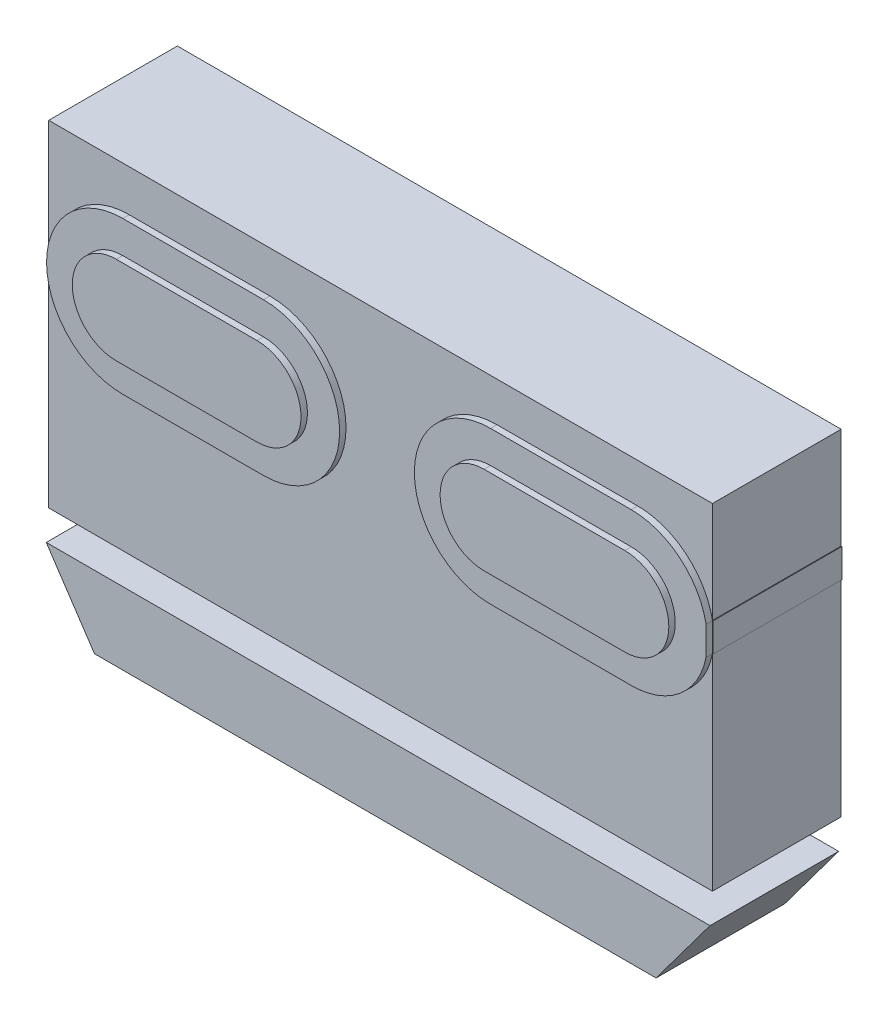
ISO-10303-21;
HEADER;
FILE_DESCRIPTION(('STEP AP214'),'2;1');
FILE_NAME('part.step','',(''),(''),'','','');
FILE_SCHEMA(('AUTOMOTIVE_DESIGN { 1 0 10303 214 1 1 1 1 }'));
ENDSEC;
DATA;
#1=APPLICATION_CONTEXT('core data for automotive mechanical design processes');
#2=APPLICATION_PROTOCOL_DEFINITION('international standard','automotive_design',2000,#1);
#3=PRODUCT_CONTEXT('',#1,'mechanical');
#4=PRODUCT('Part','Part','',(#3));
#5=PRODUCT_RELATED_PRODUCT_CATEGORY('part','',(#4));
#6=PRODUCT_DEFINITION_FORMATION('','',#4);
#7=PRODUCT_DEFINITION_CONTEXT('part definition',#1,'design');
#8=PRODUCT_DEFINITION('design','',#6,#7);
#9=PRODUCT_DEFINITION_SHAPE('','',#8);
#10=(LENGTH_UNIT() NAMED_UNIT(*) SI_UNIT(.MILLI.,.METRE.));
#11=(NAMED_UNIT(*) PLANE_ANGLE_UNIT() SI_UNIT($,.RADIAN.));
#12=(NAMED_UNIT(*) SI_UNIT($,.STERADIAN.) SOLID_ANGLE_UNIT());
#13=UNCERTAINTY_MEASURE_WITH_UNIT(LENGTH_MEASURE(1.E-05),#10,'distance_accuracy_value','');
#14=(GEOMETRIC_REPRESENTATION_CONTEXT(3) GLOBAL_UNCERTAINTY_ASSIGNED_CONTEXT((#13)) GLOBAL_UNIT_ASSIGNED_CONTEXT((#10,
#11,#12)) REPRESENTATION_CONTEXT('',''));
#15=CARTESIAN_POINT('',(0.,0.,0.));
#16=DIRECTION('',(0.,0.,1.));
#17=DIRECTION('',(1.,0.,0.));
#18=AXIS2_PLACEMENT_3D('',#15,#16,#17);
#19=CARTESIAN_POINT('',(0.,-29.4533206603702,20.));
#20=DIRECTION('',(0.,1.,0.));
#21=DIRECTION('',(0.,0.,1.));
#22=AXIS2_PLACEMENT_3D('',#19,#20,#21);
#23=PLANE('',#22);
#24=DIRECTION('',(1.,0.,0.));
#25=VECTOR('',#24,1.);
#26=CARTESIAN_POINT('',(0.,-29.4533206603702,0.));
#27=LINE('',#26,#25);
#28=CARTESIAN_POINT('',(-77.1454048954779,-29.4533206603702,0.));
#29=VERTEX_POINT('',#28);
#30=CARTESIAN_POINT('',(26.0461028836119,-29.4533206603702,0.));
#31=VERTEX_POINT('',#30);
#32=EDGE_CURVE('E107',#29,#31,#27,.T.);
#33=ORIENTED_EDGE('',*,*,#32,.F.);
#34=DIRECTION('',(0.,0.,-1.));
#35=VECTOR('',#34,1.);
#36=CARTESIAN_POINT('',(-77.1454048954779,-29.4533206603702,20.));
#37=LINE('',#36,#35);
#38=CARTESIAN_POINT('',(-77.1454048954779,-29.4533206603702,20.));
#39=VERTEX_POINT('',#38);
#40=EDGE_CURVE('E12',#39,#29,#37,.T.);
#41=ORIENTED_EDGE('',*,*,#40,.F.);
#42=DIRECTION('',(1.,0.,0.));
#43=VECTOR('',#42,1.);
#44=CARTESIAN_POINT('',(0.,-29.4533206603702,20.));
#45=LINE('',#44,#43);
#46=CARTESIAN_POINT('',(26.0461028836119,-29.4533206603702,20.));
#47=VERTEX_POINT('',#46);
#48=EDGE_CURVE('E92',#39,#47,#45,.T.);
#49=ORIENTED_EDGE('',*,*,#48,.T.);
#50=DIRECTION('',(0.,0.,-1.));
#51=VECTOR('',#50,1.);
#52=CARTESIAN_POINT('',(26.0461028836119,-29.4533206603702,20.));
#53=LINE('',#52,#51);
#54=EDGE_CURVE('E60',#47,#31,#53,.T.);
#55=ORIENTED_EDGE('',*,*,#54,.T.);
#56=EDGE_LOOP('',(#33,#41,#49,#55));
#57=FACE_BOUND('',#56,.T.);
#58=ADVANCED_FACE('F44',(#57),#23,.T.);
#59=CARTESIAN_POINT('',(-66.9800009224369,-44.6891917982016,20.));
#60=DIRECTION('',(0.83184470058085,0.555008463102641,0.));
#61=DIRECTION('',(-0.555008463102641,0.83184470058085,0.));
#62=AXIS2_PLACEMENT_3D('',#59,#60,#61);
#63=PLANE('',#62);
#64=DIRECTION('',(0.555008463102641,-0.83184470058085,0.));
#65=VECTOR('',#64,1.);
#66=CARTESIAN_POINT('',(-66.9800009224369,-44.6891917982016,0.));
#67=LINE('',#66,#65);
#68=CARTESIAN_POINT('',(-69.6456871757854,-40.6938707703688,0.));
#69=VERTEX_POINT('',#68);
#70=EDGE_CURVE('E98',#29,#69,#67,.T.);
#71=ORIENTED_EDGE('',*,*,#70,.T.);
#72=DIRECTION('',(0.,0.,-1.));
#73=VECTOR('',#72,1.);
#74=CARTESIAN_POINT('',(-69.6456871757854,-40.6938707703688,20.));
#75=LINE('',#74,#73);
#76=CARTESIAN_POINT('',(-69.6456871757854,-40.6938707703688,20.));
#77=VERTEX_POINT('',#76);
#78=EDGE_CURVE('E52',#77,#69,#75,.T.);
#79=ORIENTED_EDGE('',*,*,#78,.F.);
#80=DIRECTION('',(0.555008463102641,-0.83184470058085,0.));
#81=VECTOR('',#80,1.);
#82=CARTESIAN_POINT('',(-66.9800009224369,-44.6891917982016,20.));
#83=LINE('',#82,#81);
#84=EDGE_CURVE('E86',#39,#77,#83,.T.);
#85=ORIENTED_EDGE('',*,*,#84,.F.);
#86=ORIENTED_EDGE('',*,*,#40,.T.);
#87=EDGE_LOOP('',(#71,#79,#85,#86));
#88=FACE_BOUND('',#87,.T.);
#89=ADVANCED_FACE('F96',(#88),#63,.F.);
#90=CARTESIAN_POINT('',(0.,-40.6938707703688,20.));
#91=DIRECTION('',(0.,1.,0.));
#92=DIRECTION('',(0.,0.,1.));
#93=AXIS2_PLACEMENT_3D('',#90,#91,#92);
#94=PLANE('',#93);
#95=DIRECTION('',(1.,0.,0.));
#96=VECTOR('',#95,1.);
#97=CARTESIAN_POINT('',(0.,-40.6938707703688,0.));
#98=LINE('',#97,#96);
#99=CARTESIAN_POINT('',(17.6642786454124,-40.6938707703688,0.));
#100=VERTEX_POINT('',#99);
#101=EDGE_CURVE('E110',#69,#100,#98,.T.);
#102=ORIENTED_EDGE('',*,*,#101,.T.);
#103=DIRECTION('',(0.,0.,-1.));
#104=VECTOR('',#103,1.);
#105=CARTESIAN_POINT('',(17.6642786454124,-40.6938707703688,20.));
#106=LINE('',#105,#104);
#107=CARTESIAN_POINT('',(17.6642786454124,-40.6938707703688,20.));
#108=VERTEX_POINT('',#107);
#109=EDGE_CURVE('E74',#108,#100,#106,.T.);
#110=ORIENTED_EDGE('',*,*,#109,.F.);
#111=DIRECTION('',(1.,0.,0.));
#112=VECTOR('',#111,1.);
#113=CARTESIAN_POINT('',(0.,-40.6938707703688,20.));
#114=LINE('',#113,#112);
#115=EDGE_CURVE('E91',#77,#108,#114,.T.);
#116=ORIENTED_EDGE('',*,*,#115,.F.);
#117=ORIENTED_EDGE('',*,*,#78,.T.);
#118=EDGE_LOOP('',(#102,#110,#116,#117));
#119=FACE_BOUND('',#118,.T.);
#120=ADVANCED_FACE('F101',(#119),#94,.F.);
#121=CARTESIAN_POINT('',(30.8532809400683,-23.0065944709778,20.));
#122=DIRECTION('',(0.801660247141003,-0.59777993287984,0.));
#123=DIRECTION('',(0.59777993287984,0.801660247141003,0.));
#124=AXIS2_PLACEMENT_3D('',#121,#122,#123);
#125=PLANE('',#124);
#126=DIRECTION('',(-0.59777993287984,-0.801660247141003,0.));
#127=VECTOR('',#126,1.);
#128=CARTESIAN_POINT('',(30.8532809400683,-23.0065944709778,0.));
#129=LINE('',#128,#127);
#130=EDGE_CURVE('E112',#31,#100,#129,.T.);
#131=ORIENTED_EDGE('',*,*,#130,.F.);
#132=ORIENTED_EDGE('',*,*,#54,.F.);
#133=DIRECTION('',(-0.59777993287984,-0.801660247141003,0.));
#134=VECTOR('',#133,1.);
#135=CARTESIAN_POINT('',(30.8532809400683,-23.0065944709778,20.));
#136=LINE('',#135,#134);
#137=EDGE_CURVE('E102',#47,#108,#136,.T.);
#138=ORIENTED_EDGE('',*,*,#137,.T.);
#139=ORIENTED_EDGE('',*,*,#109,.T.);
#140=EDGE_LOOP('',(#131,#132,#138,#139));
#141=FACE_BOUND('',#140,.T.);
#142=ADVANCED_FACE('F117',(#141),#125,.T.);
#143=CARTESIAN_POINT('',(0.,0.,20.));
#144=DIRECTION('',(0.,0.,1.));
#145=DIRECTION('',(1.,0.,0.));
#146=AXIS2_PLACEMENT_3D('',#143,#144,#145);
#147=PLANE('',#146);
#148=ORIENTED_EDGE('',*,*,#48,.F.);
#149=ORIENTED_EDGE('',*,*,#84,.T.);
#150=ORIENTED_EDGE('',*,*,#115,.T.);
#151=ORIENTED_EDGE('',*,*,#137,.F.);
#152=EDGE_LOOP('',(#148,#149,#150,#151));
#153=FACE_BOUND('',#152,.T.);
#154=ADVANCED_FACE('F88',(#153),#147,.T.);
#155=CARTESIAN_POINT('',(0.,0.,0.));
#156=DIRECTION('',(0.,0.,1.));
#157=DIRECTION('',(1.,0.,0.));
#158=AXIS2_PLACEMENT_3D('',#155,#156,#157);
#159=PLANE('',#158);
#160=ORIENTED_EDGE('',*,*,#32,.T.);
#161=ORIENTED_EDGE('',*,*,#130,.T.);
#162=ORIENTED_EDGE('',*,*,#101,.F.);
#163=ORIENTED_EDGE('',*,*,#70,.F.);
#164=EDGE_LOOP('',(#160,#161,#162,#163));
#165=FACE_BOUND('',#164,.T.);
#166=ADVANCED_FACE('F124',(#165),#159,.F.);
#167=CLOSED_SHELL('',(#58,#89,#120,#142,#154,#166));
#168=MANIFOLD_SOLID_BREP('B2',#167);
#169=CARTESIAN_POINT('',(0.,0.,21.));
#170=DIRECTION('',(0.,0.,1.));
#171=DIRECTION('',(1.,0.,0.));
#172=AXIS2_PLACEMENT_3D('',#169,#170,#171);
#173=PLANE('',#172);
#174=DIRECTION('',(1.,0.,0.));
#175=VECTOR('',#174,1.);
#176=CARTESIAN_POINT('',(0.,21.4315094426788,21.));
#177=LINE('',#176,#175);
#178=CARTESIAN_POINT('',(-7.076489515905,21.4315094426788,21.));
#179=VERTEX_POINT('',#178);
#180=CARTESIAN_POINT('',(14.8067531555051,21.4315094426788,21.));
#181=VERTEX_POINT('',#180);
#182=EDGE_CURVE('E416',#179,#181,#177,.T.);
#183=ORIENTED_EDGE('',*,*,#182,.F.);
#184=CARTESIAN_POINT('',(-7.076489515905,9.59445588053529,21.));
#185=DIRECTION('',(0.,0.,1.));
#186=DIRECTION('',(1.,0.,0.));
#187=AXIS2_PLACEMENT_3D('',#184,#185,#186);
#188=CIRCLE('',#187,11.8370535621435);
#189=CARTESIAN_POINT('',(-7.076489515905,-2.24259768160822,21.));
#190=VERTEX_POINT('',#189);
#191=EDGE_CURVE('E419',#179,#190,#188,.T.);
#192=ORIENTED_EDGE('',*,*,#191,.T.);
#193=DIRECTION('',(1.,0.,0.));
#194=VECTOR('',#193,1.);
#195=CARTESIAN_POINT('',(0.,-2.24259768160822,21.));
#196=LINE('',#195,#194);
#197=CARTESIAN_POINT('',(14.8067531555051,-2.24259768160822,21.));
#198=VERTEX_POINT('',#197);
#199=EDGE_CURVE('E421',#190,#198,#196,.T.);
#200=ORIENTED_EDGE('',*,*,#199,.T.);
#201=CARTESIAN_POINT('',(14.8067531555051,9.59445588053529,21.));
#202=DIRECTION('',(0.,0.,1.));
#203=DIRECTION('',(1.,0.,0.));
#204=AXIS2_PLACEMENT_3D('',#201,#202,#203);
#205=CIRCLE('',#204,11.8370535621435);
#206=CARTESIAN_POINT('',(26.4300900283418,7.35528706742426,21.));
#207=VERTEX_POINT('',#206);
#208=EDGE_CURVE('E423',#198,#207,#205,.T.);
#209=ORIENTED_EDGE('',*,*,#208,.T.);
#210=DIRECTION('',(0.,-1.,0.));
#211=VECTOR('',#210,1.);
#212=CARTESIAN_POINT('',(26.4300900283418,0.,21.));
#213=LINE('',#212,#211);
#214=CARTESIAN_POINT('',(26.4300900283418,11.8336246936463,21.));
#215=VERTEX_POINT('',#214);
#216=EDGE_CURVE('E425',#215,#207,#213,.T.);
#217=ORIENTED_EDGE('',*,*,#216,.F.);
#218=EDGE_CURVE('E426',#215,#181,#205,.T.);
#219=ORIENTED_EDGE('',*,*,#218,.T.);
#220=EDGE_LOOP('',(#183,#192,#200,#209,#217,#219));
#221=FACE_BOUND('',#220,.T.);
#222=DIRECTION('',(-1.,0.,0.));
#223=VECTOR('',#222,1.);
#224=CARTESIAN_POINT('',(0.,2.75740231839178,21.));
#225=LINE('',#224,#223);
#226=CARTESIAN_POINT('',(14.8067531555051,2.75740231839178,21.));
#227=VERTEX_POINT('',#226);
#228=CARTESIAN_POINT('',(-7.076489515905,2.75740231839178,21.));
#229=VERTEX_POINT('',#228);
#230=EDGE_CURVE('E180',#227,#229,#225,.T.);
#231=ORIENTED_EDGE('',*,*,#230,.T.);
#232=CARTESIAN_POINT('',(-7.076489515905,9.59445588053529,21.));
#233=DIRECTION('',(0.,0.,1.));
#234=DIRECTION('',(1.,0.,0.));
#235=AXIS2_PLACEMENT_3D('',#232,#233,#234);
#236=CIRCLE('',#235,6.83705356214351);
#237=CARTESIAN_POINT('',(-7.076489515905,16.4315094426788,21.));
#238=VERTEX_POINT('',#237);
#239=EDGE_CURVE('E42',#229,#238,#236,.F.);
#240=ORIENTED_EDGE('',*,*,#239,.T.);
#241=DIRECTION('',(-1.,0.,0.));
#242=VECTOR('',#241,1.);
#243=CARTESIAN_POINT('',(0.,16.4315094426788,21.));
#244=LINE('',#243,#242);
#245=CARTESIAN_POINT('',(14.8067531555051,16.4315094426788,21.));
#246=VERTEX_POINT('',#245);
#247=EDGE_CURVE('E342',#246,#238,#244,.T.);
#248=ORIENTED_EDGE('',*,*,#247,.F.);
#249=CARTESIAN_POINT('',(14.8067531555051,9.59445588053529,21.));
#250=DIRECTION('',(0.,0.,1.));
#251=DIRECTION('',(1.,0.,0.));
#252=AXIS2_PLACEMENT_3D('',#249,#250,#251);
#253=CIRCLE('',#252,6.83705356214351);
#254=EDGE_CURVE('E190',#246,#227,#253,.F.);
#255=ORIENTED_EDGE('',*,*,#254,.T.);
#256=EDGE_LOOP('',(#231,#240,#248,#255));
#257=FACE_BOUND('',#256,.T.);
#258=ADVANCED_FACE('F172',(#221,#257),#173,.T.);
#259=CARTESIAN_POINT('',(0.,0.,21.));
#260=DIRECTION('',(0.,0.,1.));
#261=DIRECTION('',(1.,0.,0.));
#262=AXIS2_PLACEMENT_3D('',#259,#260,#261);
#263=PLANE('',#262);
#264=DIRECTION('',(1.,0.,0.));
#265=VECTOR('',#264,1.);
#266=CARTESIAN_POINT('',(0.,21.1126843900306,21.));
#267=LINE('',#266,#265);
#268=CARTESIAN_POINT('',(-64.2583537784373,21.1126843900306,21.));
#269=VERTEX_POINT('',#268);
#270=CARTESIAN_POINT('',(-42.3751111070271,21.1126843900306,21.));
#271=VERTEX_POINT('',#270);
#272=EDGE_CURVE('E447',#269,#271,#267,.T.);
#273=ORIENTED_EDGE('',*,*,#272,.F.);
#274=CARTESIAN_POINT('',(-64.2583537784373,9.27563082788707,21.));
#275=DIRECTION('',(0.,0.,1.));
#276=DIRECTION('',(1.,0.,0.));
#277=AXIS2_PLACEMENT_3D('',#274,#275,#276);
#278=CIRCLE('',#277,11.8370535621435);
#279=CARTESIAN_POINT('',(-64.2583537784373,-2.56142273425644,21.));
#280=VERTEX_POINT('',#279);
#281=EDGE_CURVE('E450',#269,#280,#278,.T.);
#282=ORIENTED_EDGE('',*,*,#281,.T.);
#283=DIRECTION('',(1.,0.,0.));
#284=VECTOR('',#283,1.);
#285=CARTESIAN_POINT('',(0.,-2.56142273425644,21.));
#286=LINE('',#285,#284);
#287=CARTESIAN_POINT('',(-42.3751111070271,-2.56142273425644,21.));
#288=VERTEX_POINT('',#287);
#289=EDGE_CURVE('E452',#280,#288,#286,.T.);
#290=ORIENTED_EDGE('',*,*,#289,.T.);
#291=CARTESIAN_POINT('',(-42.3751111070271,9.27563082788707,21.));
#292=DIRECTION('',(0.,0.,1.));
#293=DIRECTION('',(1.,0.,0.));
#294=AXIS2_PLACEMENT_3D('',#291,#292,#293);
#295=CIRCLE('',#294,11.8370535621435);
#296=EDGE_CURVE('E454',#288,#271,#295,.T.);
#297=ORIENTED_EDGE('',*,*,#296,.T.);
#298=EDGE_LOOP('',(#273,#282,#290,#297));
#299=FACE_BOUND('',#298,.T.);
#300=DIRECTION('',(-1.,0.,0.));
#301=VECTOR('',#300,1.);
#302=CARTESIAN_POINT('',(0.,2.43857726574356,21.));
#303=LINE('',#302,#301);
#304=CARTESIAN_POINT('',(-42.3751111070271,2.43857726574356,21.));
#305=VERTEX_POINT('',#304);
#306=CARTESIAN_POINT('',(-64.2583537784373,2.43857726574356,21.));
#307=VERTEX_POINT('',#306);
#308=EDGE_CURVE('E528',#305,#307,#303,.T.);
#309=ORIENTED_EDGE('',*,*,#308,.T.);
#310=CARTESIAN_POINT('',(-64.2583537784373,9.27563082788707,21.));
#311=DIRECTION('',(0.,0.,1.));
#312=DIRECTION('',(1.,0.,0.));
#313=AXIS2_PLACEMENT_3D('',#310,#311,#312);
#314=CIRCLE('',#313,6.83705356214351);
#315=CARTESIAN_POINT('',(-64.2583537784373,16.1126843900306,21.));
#316=VERTEX_POINT('',#315);
#317=EDGE_CURVE('E530',#307,#316,#314,.F.);
#318=ORIENTED_EDGE('',*,*,#317,.T.);
#319=DIRECTION('',(-1.,0.,0.));
#320=VECTOR('',#319,1.);
#321=CARTESIAN_POINT('',(0.,16.1126843900306,21.));
#322=LINE('',#321,#320);
#323=CARTESIAN_POINT('',(-42.3751111070271,16.1126843900306,21.));
#324=VERTEX_POINT('',#323);
#325=EDGE_CURVE('E523',#324,#316,#322,.T.);
#326=ORIENTED_EDGE('',*,*,#325,.F.);
#327=CARTESIAN_POINT('',(-42.3751111070271,9.27563082788707,21.));
#328=DIRECTION('',(0.,0.,1.));
#329=DIRECTION('',(1.,0.,0.));
#330=AXIS2_PLACEMENT_3D('',#327,#328,#329);
#331=CIRCLE('',#330,6.83705356214351);
#332=EDGE_CURVE('E526',#324,#305,#331,.F.);
#333=ORIENTED_EDGE('',*,*,#332,.T.);
#334=EDGE_LOOP('',(#309,#318,#326,#333));
#335=FACE_BOUND('',#334,.T.);
#336=ADVANCED_FACE('F535',(#299,#335),#263,.T.);
#337=CARTESIAN_POINT('',(26.4300900283418,0.,20.));
#338=DIRECTION('',(1.,0.,0.));
#339=DIRECTION('',(0.,0.,-1.));
#340=AXIS2_PLACEMENT_3D('',#337,#338,#339);
#341=PLANE('',#340);
#342=DIRECTION('',(0.,0.,1.));
#343=VECTOR('',#342,1.);
#344=CARTESIAN_POINT('',(26.4300900283418,11.8336246936463,20.));
#345=LINE('',#344,#343);
#346=CARTESIAN_POINT('',(26.4300900283418,11.8336246936463,0.));
#347=VERTEX_POINT('',#346);
#348=CARTESIAN_POINT('',(26.4300900283418,11.8336246936463,20.));
#349=VERTEX_POINT('',#348);
#350=EDGE_CURVE('E391',#347,#349,#345,.T.);
#351=ORIENTED_EDGE('',*,*,#350,.F.);
#352=DIRECTION('',(0.,-1.,0.));
#353=VECTOR('',#352,1.);
#354=CARTESIAN_POINT('',(26.4300900283418,0.,0.));
#355=LINE('',#354,#353);
#356=CARTESIAN_POINT('',(26.4300900283418,27.5743521353241,0.));
#357=VERTEX_POINT('',#356);
#358=EDGE_CURVE('E472',#357,#347,#355,.T.);
#359=ORIENTED_EDGE('',*,*,#358,.F.);
#360=DIRECTION('',(0.,0.,-1.));
#361=VECTOR('',#360,1.);
#362=CARTESIAN_POINT('',(26.4300900283418,27.5743521353241,20.));
#363=LINE('',#362,#361);
#364=CARTESIAN_POINT('',(26.4300900283418,27.5743521353241,20.));
#365=VERTEX_POINT('',#364);
#366=EDGE_CURVE('E520',#365,#357,#363,.T.);
#367=ORIENTED_EDGE('',*,*,#366,.F.);
#368=DIRECTION('',(0.,-1.,0.));
#369=VECTOR('',#368,1.);
#370=CARTESIAN_POINT('',(26.4300900283418,0.,20.));
#371=LINE('',#370,#369);
#372=EDGE_CURVE('E477',#365,#349,#371,.T.);
#373=ORIENTED_EDGE('',*,*,#372,.T.);
#374=EDGE_LOOP('',(#351,#359,#367,#373));
#375=FACE_BOUND('',#374,.T.);
#376=ADVANCED_FACE('F569',(#375),#341,.T.);
#377=DIRECTION('',(0.,-1.,0.));
#378=VECTOR('',#377,1.);
#379=CARTESIAN_POINT('',(26.4300900283418,11.8336246936463,20.));
#380=LINE('',#379,#378);
#381=CARTESIAN_POINT('',(26.4300900283418,7.35528706742426,20.));
#382=VERTEX_POINT('',#381);
#383=EDGE_CURVE('E386',#349,#382,#380,.T.);
#384=ORIENTED_EDGE('',*,*,#383,.F.);
#385=DIRECTION('',(0.,0.,-1.));
#386=VECTOR('',#385,1.);
#387=CARTESIAN_POINT('',(26.4300900283418,11.8336246936463,21.));
#388=LINE('',#387,#386);
#389=EDGE_CURVE('E432',#215,#349,#388,.T.);
#390=ORIENTED_EDGE('',*,*,#389,.F.);
#391=ORIENTED_EDGE('',*,*,#216,.T.);
#392=DIRECTION('',(0.,0.,-1.));
#393=VECTOR('',#392,1.);
#394=CARTESIAN_POINT('',(26.4300900283418,7.35528706742426,21.));
#395=LINE('',#394,#393);
#396=EDGE_CURVE('E435',#207,#382,#395,.T.);
#397=ORIENTED_EDGE('',*,*,#396,.T.);
#398=EDGE_LOOP('',(#384,#390,#391,#397));
#399=FACE_BOUND('',#398,.T.);
#400=ADVANCED_FACE('F623',(#399),#341,.T.);
#401=CARTESIAN_POINT('',(0.,27.5743521353241,20.));
#402=DIRECTION('',(0.,1.,0.));
#403=DIRECTION('',(0.,0.,1.));
#404=AXIS2_PLACEMENT_3D('',#401,#402,#403);
#405=PLANE('',#404);
#406=DIRECTION('',(1.,0.,0.));
#407=VECTOR('',#406,1.);
#408=CARTESIAN_POINT('',(0.,27.5743521353241,0.));
#409=LINE('',#408,#407);
#410=CARTESIAN_POINT('',(-76.7614177507479,27.5743521353241,0.));
#411=VERTEX_POINT('',#410);
#412=EDGE_CURVE('E468',#411,#357,#409,.T.);
#413=ORIENTED_EDGE('',*,*,#412,.F.);
#414=DIRECTION('',(0.,0.,-1.));
#415=VECTOR('',#414,1.);
#416=CARTESIAN_POINT('',(-76.7614177507479,27.5743521353241,20.));
#417=LINE('',#416,#415);
#418=CARTESIAN_POINT('',(-76.7614177507479,27.5743521353241,20.));
#419=VERTEX_POINT('',#418);
#420=EDGE_CURVE('E518',#419,#411,#417,.T.);
#421=ORIENTED_EDGE('',*,*,#420,.F.);
#422=DIRECTION('',(1.,0.,0.));
#423=VECTOR('',#422,1.);
#424=CARTESIAN_POINT('',(0.,27.5743521353241,20.));
#425=LINE('',#424,#423);
#426=EDGE_CURVE('E481',#419,#365,#425,.T.);
#427=ORIENTED_EDGE('',*,*,#426,.T.);
#428=ORIENTED_EDGE('',*,*,#366,.T.);
#429=EDGE_LOOP('',(#413,#421,#427,#428));
#430=FACE_BOUND('',#429,.T.);
#431=ADVANCED_FACE('F174',(#430),#405,.T.);
#432=CARTESIAN_POINT('',(-76.7614177507479,0.,20.));
#433=DIRECTION('',(1.,0.,0.));
#434=DIRECTION('',(0.,0.,-1.));
#435=AXIS2_PLACEMENT_3D('',#432,#433,#434);
#436=PLANE('',#435);
#437=DIRECTION('',(0.,-1.,0.));
#438=VECTOR('',#437,1.);
#439=CARTESIAN_POINT('',(-76.7614177507479,0.,0.));
#440=LINE('',#439,#438);
#441=CARTESIAN_POINT('',(-76.7614177507479,-24.6202433678059,0.));
#442=VERTEX_POINT('',#441);
#443=EDGE_CURVE('E508',#411,#442,#440,.T.);
#444=ORIENTED_EDGE('',*,*,#443,.T.);
#445=DIRECTION('',(0.,0.,-1.));
#446=VECTOR('',#445,1.);
#447=CARTESIAN_POINT('',(-76.7614177507479,-24.6202433678059,20.));
#448=LINE('',#447,#446);
#449=CARTESIAN_POINT('',(-76.7614177507479,-24.6202433678059,20.));
#450=VERTEX_POINT('',#449);
#451=EDGE_CURVE('E515',#450,#442,#448,.T.);
#452=ORIENTED_EDGE('',*,*,#451,.F.);
#453=DIRECTION('',(0.,-1.,0.));
#454=VECTOR('',#453,1.);
#455=CARTESIAN_POINT('',(-76.7614177507479,0.,20.));
#456=LINE('',#455,#454);
#457=EDGE_CURVE('E485',#419,#450,#456,.T.);
#458=ORIENTED_EDGE('',*,*,#457,.F.);
#459=ORIENTED_EDGE('',*,*,#420,.T.);
#460=EDGE_LOOP('',(#444,#452,#458,#459));
#461=FACE_BOUND('',#460,.T.);
#462=ADVANCED_FACE('F625',(#461),#436,.F.);
#463=CARTESIAN_POINT('',(0.,-24.6202433678059,20.));
#464=DIRECTION('',(0.,1.,0.));
#465=DIRECTION('',(0.,0.,1.));
#466=AXIS2_PLACEMENT_3D('',#463,#464,#465);
#467=PLANE('',#466);
#468=DIRECTION('',(1.,0.,0.));
#469=VECTOR('',#468,1.);
#470=CARTESIAN_POINT('',(0.,-24.6202433678059,0.));
#471=LINE('',#470,#469);
#472=CARTESIAN_POINT('',(26.4300900283418,-24.6202433678059,0.));
#473=VERTEX_POINT('',#472);
#474=EDGE_CURVE('E510',#442,#473,#471,.T.);
#475=ORIENTED_EDGE('',*,*,#474,.T.);
#476=DIRECTION('',(0.,0.,-1.));
#477=VECTOR('',#476,1.);
#478=CARTESIAN_POINT('',(26.4300900283418,-24.6202433678059,20.));
#479=LINE('',#478,#477);
#480=CARTESIAN_POINT('',(26.4300900283418,-24.6202433678059,20.));
#481=VERTEX_POINT('',#480);
#482=EDGE_CURVE('E502',#481,#473,#479,.T.);
#483=ORIENTED_EDGE('',*,*,#482,.F.);
#484=DIRECTION('',(1.,0.,0.));
#485=VECTOR('',#484,1.);
#486=CARTESIAN_POINT('',(0.,-24.6202433678059,20.));
#487=LINE('',#486,#485);
#488=EDGE_CURVE('E487',#450,#481,#487,.T.);
#489=ORIENTED_EDGE('',*,*,#488,.F.);
#490=ORIENTED_EDGE('',*,*,#451,.T.);
#491=EDGE_LOOP('',(#475,#483,#489,#490));
#492=FACE_BOUND('',#491,.T.);
#493=ADVANCED_FACE('F621',(#492),#467,.F.);
#494=DIRECTION('',(0.,0.,-1.));
#495=VECTOR('',#494,1.);
#496=CARTESIAN_POINT('',(26.4300900283418,7.35528706742426,20.));
#497=LINE('',#496,#495);
#498=CARTESIAN_POINT('',(26.4300900283418,7.35528706742426,0.));
#499=VERTEX_POINT('',#498);
#500=EDGE_CURVE('E400',#382,#499,#497,.T.);
#501=ORIENTED_EDGE('',*,*,#500,.F.);
#502=EDGE_CURVE('E482',#382,#481,#371,.T.);
#503=ORIENTED_EDGE('',*,*,#502,.T.);
#504=ORIENTED_EDGE('',*,*,#482,.T.);
#505=EDGE_CURVE('E505',#499,#473,#355,.T.);
#506=ORIENTED_EDGE('',*,*,#505,.F.);
#507=EDGE_LOOP('',(#501,#503,#504,#506));
#508=FACE_BOUND('',#507,.T.);
#509=ADVANCED_FACE('F614',(#508),#341,.T.);
#510=CARTESIAN_POINT('',(0.,0.,20.));
#511=DIRECTION('',(0.,0.,1.));
#512=DIRECTION('',(1.,0.,0.));
#513=AXIS2_PLACEMENT_3D('',#510,#511,#512);
#514=PLANE('',#513);
#515=CARTESIAN_POINT('',(-7.076489515905,9.59445588053529,20.));
#516=DIRECTION('',(0.,0.,1.));
#517=DIRECTION('',(1.,0.,0.));
#518=AXIS2_PLACEMENT_3D('',#515,#516,#517);
#519=CIRCLE('',#518,11.8370535621435);
#520=CARTESIAN_POINT('',(-7.076489515905,21.4315094426788,20.));
#521=VERTEX_POINT('',#520);
#522=CARTESIAN_POINT('',(-7.076489515905,-2.24259768160822,20.));
#523=VERTEX_POINT('',#522);
#524=EDGE_CURVE('E469',#521,#523,#519,.T.);
#525=ORIENTED_EDGE('',*,*,#524,.F.);
#526=DIRECTION('',(1.,0.,0.));
#527=VECTOR('',#526,1.);
#528=CARTESIAN_POINT('',(0.,21.4315094426788,20.));
#529=LINE('',#528,#527);
#530=CARTESIAN_POINT('',(14.8067531555051,21.4315094426788,20.));
#531=VERTEX_POINT('',#530);
#532=EDGE_CURVE('E471',#521,#531,#529,.T.);
#533=ORIENTED_EDGE('',*,*,#532,.T.);
#534=CARTESIAN_POINT('',(14.8067531555051,9.59445588053529,20.));
#535=DIRECTION('',(0.,0.,1.));
#536=DIRECTION('',(1.,0.,0.));
#537=AXIS2_PLACEMENT_3D('',#534,#535,#536);
#538=CIRCLE('',#537,11.8370535621435);
#539=EDGE_CURVE('E475',#349,#531,#538,.T.);
#540=ORIENTED_EDGE('',*,*,#539,.F.);
#541=ORIENTED_EDGE('',*,*,#372,.F.);
#542=ORIENTED_EDGE('',*,*,#426,.F.);
#543=ORIENTED_EDGE('',*,*,#457,.T.);
#544=ORIENTED_EDGE('',*,*,#488,.T.);
#545=ORIENTED_EDGE('',*,*,#502,.F.);
#546=CARTESIAN_POINT('',(14.8067531555051,-2.24259768160822,20.));
#547=VERTEX_POINT('',#546);
#548=EDGE_CURVE('E478',#547,#382,#538,.T.);
#549=ORIENTED_EDGE('',*,*,#548,.F.);
#550=DIRECTION('',(1.,0.,0.));
#551=VECTOR('',#550,1.);
#552=CARTESIAN_POINT('',(0.,-2.24259768160822,20.));
#553=LINE('',#552,#551);
#554=EDGE_CURVE('E489',#523,#547,#553,.T.);
#555=ORIENTED_EDGE('',*,*,#554,.F.);
#556=EDGE_LOOP('',(#525,#533,#540,#541,#542,#543,#544,#545,#549,#555));
#557=FACE_BOUND('',#556,.T.);
#558=CARTESIAN_POINT('',(-64.2583537784373,9.27563082788707,20.));
#559=DIRECTION('',(0.,0.,1.));
#560=DIRECTION('',(1.,0.,0.));
#561=AXIS2_PLACEMENT_3D('',#558,#559,#560);
#562=CIRCLE('',#561,11.8370535621435);
#563=CARTESIAN_POINT('',(-64.2583537784373,21.1126843900306,20.));
#564=VERTEX_POINT('',#563);
#565=CARTESIAN_POINT('',(-64.2583537784373,-2.56142273425644,20.));
#566=VERTEX_POINT('',#565);
#567=EDGE_CURVE('E491',#564,#566,#562,.T.);
#568=ORIENTED_EDGE('',*,*,#567,.F.);
#569=DIRECTION('',(1.,0.,0.));
#570=VECTOR('',#569,1.);
#571=CARTESIAN_POINT('',(0.,21.1126843900306,20.));
#572=LINE('',#571,#570);
#573=CARTESIAN_POINT('',(-42.3751111070271,21.1126843900306,20.));
#574=VERTEX_POINT('',#573);
#575=EDGE_CURVE('E494',#564,#574,#572,.T.);
#576=ORIENTED_EDGE('',*,*,#575,.T.);
#577=CARTESIAN_POINT('',(-42.3751111070271,9.27563082788707,20.));
#578=DIRECTION('',(0.,0.,1.));
#579=DIRECTION('',(1.,0.,0.));
#580=AXIS2_PLACEMENT_3D('',#577,#578,#579);
#581=CIRCLE('',#580,11.8370535621435);
#582=CARTESIAN_POINT('',(-42.3751111070271,-2.56142273425644,20.));
#583=VERTEX_POINT('',#582);
#584=EDGE_CURVE('E496',#583,#574,#581,.T.);
#585=ORIENTED_EDGE('',*,*,#584,.F.);
#586=DIRECTION('',(1.,0.,0.));
#587=VECTOR('',#586,1.);
#588=CARTESIAN_POINT('',(0.,-2.56142273425644,20.));
#589=LINE('',#588,#587);
#590=EDGE_CURVE('E499',#566,#583,#589,.T.);
#591=ORIENTED_EDGE('',*,*,#590,.F.);
#592=EDGE_LOOP('',(#568,#576,#585,#591));
#593=FACE_BOUND('',#592,.T.);
#594=ADVANCED_FACE('F611',(#557,#593),#514,.T.);
#595=CARTESIAN_POINT('',(0.,0.,0.));
#596=DIRECTION('',(0.,0.,1.));
#597=DIRECTION('',(1.,0.,0.));
#598=AXIS2_PLACEMENT_3D('',#595,#596,#597);
#599=PLANE('',#598);
#600=ORIENTED_EDGE('',*,*,#412,.T.);
#601=ORIENTED_EDGE('',*,*,#358,.T.);
#602=DIRECTION('',(-1.,0.,0.));
#603=VECTOR('',#602,1.);
#604=CARTESIAN_POINT('',(26.5300900283418,11.8336246936463,0.));
#605=LINE('',#604,#603);
#606=CARTESIAN_POINT('',(26.5300900283418,11.8336246936463,0.));
#607=VERTEX_POINT('',#606);
#608=EDGE_CURVE('E407',#607,#347,#605,.T.);
#609=ORIENTED_EDGE('',*,*,#608,.F.);
#610=DIRECTION('',(0.,1.,0.));
#611=VECTOR('',#610,1.);
#612=CARTESIAN_POINT('',(26.5300900283418,11.8336246936463,0.));
#613=LINE('',#612,#611);
#614=CARTESIAN_POINT('',(26.5300900283418,7.35528706742426,0.));
#615=VERTEX_POINT('',#614);
#616=EDGE_CURVE('E393',#615,#607,#613,.T.);
#617=ORIENTED_EDGE('',*,*,#616,.F.);
#618=DIRECTION('',(-1.,0.,0.));
#619=VECTOR('',#618,1.);
#620=CARTESIAN_POINT('',(26.5300900283418,7.35528706742426,0.));
#621=LINE('',#620,#619);
#622=EDGE_CURVE('E410',#615,#499,#621,.T.);
#623=ORIENTED_EDGE('',*,*,#622,.T.);
#624=ORIENTED_EDGE('',*,*,#505,.T.);
#625=ORIENTED_EDGE('',*,*,#474,.F.);
#626=ORIENTED_EDGE('',*,*,#443,.F.);
#627=EDGE_LOOP('',(#600,#601,#609,#617,#623,#624,#625,#626));
#628=FACE_BOUND('',#627,.T.);
#629=ADVANCED_FACE('F609',(#628),#599,.F.);
#630=CARTESIAN_POINT('',(0.,21.1126843900306,21.));
#631=DIRECTION('',(0.,1.,0.));
#632=DIRECTION('',(0.,0.,1.));
#633=AXIS2_PLACEMENT_3D('',#630,#631,#632);
#634=PLANE('',#633);
#635=DIRECTION('',(0.,0.,-1.));
#636=VECTOR('',#635,1.);
#637=CARTESIAN_POINT('',(-42.3751111070271,21.1126843900306,21.));
#638=LINE('',#637,#636);
#639=EDGE_CURVE('E456',#271,#574,#638,.T.);
#640=ORIENTED_EDGE('',*,*,#639,.T.);
#641=ORIENTED_EDGE('',*,*,#575,.F.);
#642=DIRECTION('',(0.,0.,-1.));
#643=VECTOR('',#642,1.);
#644=CARTESIAN_POINT('',(-64.2583537784373,21.1126843900306,21.));
#645=LINE('',#644,#643);
#646=EDGE_CURVE('E465',#269,#564,#645,.T.);
#647=ORIENTED_EDGE('',*,*,#646,.F.);
#648=ORIENTED_EDGE('',*,*,#272,.T.);
#649=EDGE_LOOP('',(#640,#641,#647,#648));
#650=FACE_BOUND('',#649,.T.);
#651=ADVANCED_FACE('F605',(#650),#634,.T.);
#652=CARTESIAN_POINT('',(-64.2583537784373,9.27563082788707,21.));
#653=DIRECTION('',(0.,0.,-1.));
#654=DIRECTION('',(-1.,0.,0.));
#655=AXIS2_PLACEMENT_3D('',#652,#653,#654);
#656=CYLINDRICAL_SURFACE('',#655,11.8370535621435);
#657=ORIENTED_EDGE('',*,*,#567,.T.);
#658=DIRECTION('',(0.,0.,-1.));
#659=VECTOR('',#658,1.);
#660=CARTESIAN_POINT('',(-64.2583537784373,-2.56142273425644,21.));
#661=LINE('',#660,#659);
#662=EDGE_CURVE('E462',#280,#566,#661,.T.);
#663=ORIENTED_EDGE('',*,*,#662,.F.);
#664=ORIENTED_EDGE('',*,*,#281,.F.);
#665=ORIENTED_EDGE('',*,*,#646,.T.);
#666=EDGE_LOOP('',(#657,#663,#664,#665));
#667=FACE_BOUND('',#666,.T.);
#668=ADVANCED_FACE('F601',(#667),#656,.T.);
#669=CARTESIAN_POINT('',(0.,-2.56142273425644,21.));
#670=DIRECTION('',(0.,1.,0.));
#671=DIRECTION('',(-1.,0.,0.));
#672=AXIS2_PLACEMENT_3D('',#669,#670,#671);
#673=PLANE('',#672);
#674=ORIENTED_EDGE('',*,*,#590,.T.);
#675=DIRECTION('',(0.,0.,-1.));
#676=VECTOR('',#675,1.);
#677=CARTESIAN_POINT('',(-42.3751111070271,-2.56142273425644,21.));
#678=LINE('',#677,#676);
#679=EDGE_CURVE('E459',#288,#583,#678,.T.);
#680=ORIENTED_EDGE('',*,*,#679,.F.);
#681=ORIENTED_EDGE('',*,*,#289,.F.);
#682=ORIENTED_EDGE('',*,*,#662,.T.);
#683=EDGE_LOOP('',(#674,#680,#681,#682));
#684=FACE_BOUND('',#683,.T.);
#685=ADVANCED_FACE('F597',(#684),#673,.F.);
#686=CARTESIAN_POINT('',(-42.3751111070271,9.27563082788707,21.));
#687=DIRECTION('',(0.,0.,-1.));
#688=DIRECTION('',(-1.,0.,0.));
#689=AXIS2_PLACEMENT_3D('',#686,#687,#688);
#690=CYLINDRICAL_SURFACE('',#689,11.8370535621435);
#691=ORIENTED_EDGE('',*,*,#584,.T.);
#692=ORIENTED_EDGE('',*,*,#639,.F.);
#693=ORIENTED_EDGE('',*,*,#296,.F.);
#694=ORIENTED_EDGE('',*,*,#679,.T.);
#695=EDGE_LOOP('',(#691,#692,#693,#694));
#696=FACE_BOUND('',#695,.T.);
#697=ADVANCED_FACE('F592',(#696),#690,.T.);
#698=CARTESIAN_POINT('',(0.,21.4315094426788,21.));
#699=DIRECTION('',(0.,1.,0.));
#700=DIRECTION('',(0.,0.,1.));
#701=AXIS2_PLACEMENT_3D('',#698,#699,#700);
#702=PLANE('',#701);
#703=DIRECTION('',(0.,0.,-1.));
#704=VECTOR('',#703,1.);
#705=CARTESIAN_POINT('',(14.8067531555051,21.4315094426788,21.));
#706=LINE('',#705,#704);
#707=EDGE_CURVE('E429',#181,#531,#706,.T.);
#708=ORIENTED_EDGE('',*,*,#707,.T.);
#709=ORIENTED_EDGE('',*,*,#532,.F.);
#710=DIRECTION('',(0.,0.,-1.));
#711=VECTOR('',#710,1.);
#712=CARTESIAN_POINT('',(-7.076489515905,21.4315094426788,21.));
#713=LINE('',#712,#711);
#714=EDGE_CURVE('E444',#179,#521,#713,.T.);
#715=ORIENTED_EDGE('',*,*,#714,.F.);
#716=ORIENTED_EDGE('',*,*,#182,.T.);
#717=EDGE_LOOP('',(#708,#709,#715,#716));
#718=FACE_BOUND('',#717,.T.);
#719=ADVANCED_FACE('F589',(#718),#702,.T.);
#720=CARTESIAN_POINT('',(-7.076489515905,9.59445588053529,21.));
#721=DIRECTION('',(0.,0.,-1.));
#722=DIRECTION('',(-1.,0.,0.));
#723=AXIS2_PLACEMENT_3D('',#720,#721,#722);
#724=CYLINDRICAL_SURFACE('',#723,11.8370535621435);
#725=ORIENTED_EDGE('',*,*,#524,.T.);
#726=DIRECTION('',(0.,0.,-1.));
#727=VECTOR('',#726,1.);
#728=CARTESIAN_POINT('',(-7.076489515905,-2.24259768160822,21.));
#729=LINE('',#728,#727);
#730=EDGE_CURVE('E441',#190,#523,#729,.T.);
#731=ORIENTED_EDGE('',*,*,#730,.F.);
#732=ORIENTED_EDGE('',*,*,#191,.F.);
#733=ORIENTED_EDGE('',*,*,#714,.T.);
#734=EDGE_LOOP('',(#725,#731,#732,#733));
#735=FACE_BOUND('',#734,.T.);
#736=ADVANCED_FACE('F585',(#735),#724,.T.);
#737=CARTESIAN_POINT('',(0.,-2.24259768160822,21.));
#738=DIRECTION('',(0.,1.,0.));
#739=DIRECTION('',(-1.,0.,0.));
#740=AXIS2_PLACEMENT_3D('',#737,#738,#739);
#741=PLANE('',#740);
#742=ORIENTED_EDGE('',*,*,#554,.T.);
#743=DIRECTION('',(0.,0.,-1.));
#744=VECTOR('',#743,1.);
#745=CARTESIAN_POINT('',(14.8067531555051,-2.24259768160822,21.));
#746=LINE('',#745,#744);
#747=EDGE_CURVE('E438',#198,#547,#746,.T.);
#748=ORIENTED_EDGE('',*,*,#747,.F.);
#749=ORIENTED_EDGE('',*,*,#199,.F.);
#750=ORIENTED_EDGE('',*,*,#730,.T.);
#751=EDGE_LOOP('',(#742,#748,#749,#750));
#752=FACE_BOUND('',#751,.T.);
#753=ADVANCED_FACE('F582',(#752),#741,.F.);
#754=CARTESIAN_POINT('',(14.8067531555051,9.59445588053529,21.));
#755=DIRECTION('',(0.,0.,-1.));
#756=DIRECTION('',(-1.,0.,0.));
#757=AXIS2_PLACEMENT_3D('',#754,#755,#756);
#758=CYLINDRICAL_SURFACE('',#757,11.8370535621435);
#759=ORIENTED_EDGE('',*,*,#548,.T.);
#760=ORIENTED_EDGE('',*,*,#396,.F.);
#761=ORIENTED_EDGE('',*,*,#208,.F.);
#762=ORIENTED_EDGE('',*,*,#747,.T.);
#763=EDGE_LOOP('',(#759,#760,#761,#762));
#764=FACE_BOUND('',#763,.T.);
#765=ADVANCED_FACE('F580',(#764),#758,.T.);
#766=ORIENTED_EDGE('',*,*,#539,.T.);
#767=ORIENTED_EDGE('',*,*,#707,.F.);
#768=ORIENTED_EDGE('',*,*,#218,.F.);
#769=ORIENTED_EDGE('',*,*,#389,.T.);
#770=EDGE_LOOP('',(#766,#767,#768,#769));
#771=FACE_BOUND('',#770,.T.);
#772=ADVANCED_FACE('F577',(#771),#758,.T.);
#773=CARTESIAN_POINT('',(26.5300900283418,11.8336246936463,20.));
#774=DIRECTION('',(0.,0.,-1.));
#775=DIRECTION('',(-1.,0.,0.));
#776=AXIS2_PLACEMENT_3D('',#773,#774,#775);
#777=PLANE('',#776);
#778=ORIENTED_EDGE('',*,*,#383,.T.);
#779=DIRECTION('',(-1.,0.,0.));
#780=VECTOR('',#779,1.);
#781=CARTESIAN_POINT('',(26.5300900283418,7.35528706742426,20.));
#782=LINE('',#781,#780);
#783=CARTESIAN_POINT('',(26.5300900283418,7.35528706742426,20.));
#784=VERTEX_POINT('',#783);
#785=EDGE_CURVE('E413',#784,#382,#782,.T.);
#786=ORIENTED_EDGE('',*,*,#785,.F.);
#787=DIRECTION('',(0.,-1.,0.));
#788=VECTOR('',#787,1.);
#789=CARTESIAN_POINT('',(26.5300900283418,11.8336246936463,20.));
#790=LINE('',#789,#788);
#791=CARTESIAN_POINT('',(26.5300900283418,11.8336246936463,20.));
#792=VERTEX_POINT('',#791);
#793=EDGE_CURVE('E387',#792,#784,#790,.T.);
#794=ORIENTED_EDGE('',*,*,#793,.F.);
#795=DIRECTION('',(-1.,0.,0.));
#796=VECTOR('',#795,1.);
#797=CARTESIAN_POINT('',(26.5300900283418,11.8336246936463,20.));
#798=LINE('',#797,#796);
#799=EDGE_CURVE('E397',#792,#349,#798,.T.);
#800=ORIENTED_EDGE('',*,*,#799,.T.);
#801=EDGE_LOOP('',(#778,#786,#794,#800));
#802=FACE_BOUND('',#801,.T.);
#803=ADVANCED_FACE('F575',(#802),#777,.F.);
#804=CARTESIAN_POINT('',(26.5300900283418,7.35528706742426,20.));
#805=DIRECTION('',(0.,1.,0.));
#806=DIRECTION('',(0.,0.,1.));
#807=AXIS2_PLACEMENT_3D('',#804,#805,#806);
#808=PLANE('',#807);
#809=ORIENTED_EDGE('',*,*,#500,.T.);
#810=ORIENTED_EDGE('',*,*,#622,.F.);
#811=DIRECTION('',(0.,0.,-1.));
#812=VECTOR('',#811,1.);
#813=CARTESIAN_POINT('',(26.5300900283418,7.35528706742426,20.));
#814=LINE('',#813,#812);
#815=EDGE_CURVE('E390',#784,#615,#814,.T.);
#816=ORIENTED_EDGE('',*,*,#815,.F.);
#817=ORIENTED_EDGE('',*,*,#785,.T.);
#818=EDGE_LOOP('',(#809,#810,#816,#817));
#819=FACE_BOUND('',#818,.T.);
#820=ADVANCED_FACE('F674',(#819),#808,.F.);
#821=CARTESIAN_POINT('',(26.5300900283418,11.8336246936463,20.));
#822=DIRECTION('',(0.,-1.,0.));
#823=DIRECTION('',(0.,0.,-1.));
#824=AXIS2_PLACEMENT_3D('',#821,#822,#823);
#825=PLANE('',#824);
#826=ORIENTED_EDGE('',*,*,#350,.T.);
#827=ORIENTED_EDGE('',*,*,#799,.F.);
#828=DIRECTION('',(0.,0.,1.));
#829=VECTOR('',#828,1.);
#830=CARTESIAN_POINT('',(26.5300900283418,11.8336246936463,20.));
#831=LINE('',#830,#829);
#832=EDGE_CURVE('E395',#607,#792,#831,.T.);
#833=ORIENTED_EDGE('',*,*,#832,.F.);
#834=ORIENTED_EDGE('',*,*,#608,.T.);
#835=EDGE_LOOP('',(#826,#827,#833,#834));
#836=FACE_BOUND('',#835,.T.);
#837=ADVANCED_FACE('F666',(#836),#825,.F.);
#838=CARTESIAN_POINT('',(26.5300900283418,0.,0.));
#839=DIRECTION('',(1.,0.,0.));
#840=DIRECTION('',(0.,0.,-1.));
#841=AXIS2_PLACEMENT_3D('',#838,#839,#840);
#842=PLANE('',#841);
#843=ORIENTED_EDGE('',*,*,#793,.T.);
#844=ORIENTED_EDGE('',*,*,#815,.T.);
#845=ORIENTED_EDGE('',*,*,#616,.T.);
#846=ORIENTED_EDGE('',*,*,#832,.T.);
#847=EDGE_LOOP('',(#843,#844,#845,#846));
#848=FACE_BOUND('',#847,.T.);
#849=ADVANCED_FACE('F561',(#848),#842,.T.);
#850=CARTESIAN_POINT('',(-64.2583537784373,9.27563082788707,22.));
#851=DIRECTION('',(0.,0.,-1.));
#852=DIRECTION('',(-1.,0.,0.));
#853=AXIS2_PLACEMENT_3D('',#850,#851,#852);
#854=CYLINDRICAL_SURFACE('',#853,6.83705356214351);
#855=ORIENTED_EDGE('',*,*,#317,.F.);
#856=DIRECTION('',(0.,0.,-1.));
#857=VECTOR('',#856,1.);
#858=CARTESIAN_POINT('',(-64.2583537784373,2.43857726574356,22.));
#859=LINE('',#858,#857);
#860=CARTESIAN_POINT('',(-64.2583537784373,2.43857726574356,22.));
#861=VERTEX_POINT('',#860);
#862=EDGE_CURVE('E383',#861,#307,#859,.T.);
#863=ORIENTED_EDGE('',*,*,#862,.F.);
#864=CARTESIAN_POINT('',(-64.2583537784373,9.27563082788707,22.));
#865=DIRECTION('',(0.,0.,1.));
#866=DIRECTION('',(1.,0.,0.));
#867=AXIS2_PLACEMENT_3D('',#864,#865,#866);
#868=CIRCLE('',#867,6.83705356214351);
#869=CARTESIAN_POINT('',(-64.2583537784373,16.1126843900306,22.));
#870=VERTEX_POINT('',#869);
#871=EDGE_CURVE('E353',#870,#861,#868,.T.);
#872=ORIENTED_EDGE('',*,*,#871,.F.);
#873=DIRECTION('',(0.,0.,-1.));
#874=VECTOR('',#873,1.);
#875=CARTESIAN_POINT('',(-64.2583537784373,16.1126843900306,22.));
#876=LINE('',#875,#874);
#877=EDGE_CURVE('E374',#870,#316,#876,.T.);
#878=ORIENTED_EDGE('',*,*,#877,.T.);
#879=EDGE_LOOP('',(#855,#863,#872,#878));
#880=FACE_BOUND('',#879,.T.);
#881=ADVANCED_FACE('F544',(#880),#854,.T.);
#882=CARTESIAN_POINT('',(-64.2583537784373,2.43857726574356,22.));
#883=DIRECTION('',(0.,1.,0.));
#884=DIRECTION('',(0.,0.,1.));
#885=AXIS2_PLACEMENT_3D('',#882,#883,#884);
#886=PLANE('',#885);
#887=ORIENTED_EDGE('',*,*,#308,.F.);
#888=DIRECTION('',(0.,0.,-1.));
#889=VECTOR('',#888,1.);
#890=CARTESIAN_POINT('',(-42.3751111070271,2.43857726574356,22.));
#891=LINE('',#890,#889);
#892=CARTESIAN_POINT('',(-42.3751111070271,2.43857726574356,22.));
#893=VERTEX_POINT('',#892);
#894=EDGE_CURVE('E380',#893,#305,#891,.T.);
#895=ORIENTED_EDGE('',*,*,#894,.F.);
#896=DIRECTION('',(1.,0.,0.));
#897=VECTOR('',#896,1.);
#898=CARTESIAN_POINT('',(-64.2583537784373,2.43857726574356,22.));
#899=LINE('',#898,#897);
#900=EDGE_CURVE('E367',#861,#893,#899,.T.);
#901=ORIENTED_EDGE('',*,*,#900,.F.);
#902=ORIENTED_EDGE('',*,*,#862,.T.);
#903=EDGE_LOOP('',(#887,#895,#901,#902));
#904=FACE_BOUND('',#903,.T.);
#905=ADVANCED_FACE('F553',(#904),#886,.F.);
#906=CARTESIAN_POINT('',(-42.3751111070271,9.27563082788707,22.));
#907=DIRECTION('',(0.,0.,-1.));
#908=DIRECTION('',(-1.,0.,0.));
#909=AXIS2_PLACEMENT_3D('',#906,#907,#908);
#910=CYLINDRICAL_SURFACE('',#909,6.83705356214351);
#911=ORIENTED_EDGE('',*,*,#332,.F.);
#912=DIRECTION('',(0.,0.,-1.));
#913=VECTOR('',#912,1.);
#914=CARTESIAN_POINT('',(-42.3751111070271,16.1126843900306,22.));
#915=LINE('',#914,#913);
#916=CARTESIAN_POINT('',(-42.3751111070271,16.1126843900306,22.));
#917=VERTEX_POINT('',#916);
#918=EDGE_CURVE('E377',#917,#324,#915,.T.);
#919=ORIENTED_EDGE('',*,*,#918,.F.);
#920=CARTESIAN_POINT('',(-42.3751111070271,9.27563082788707,22.));
#921=DIRECTION('',(0.,0.,1.));
#922=DIRECTION('',(1.,0.,0.));
#923=AXIS2_PLACEMENT_3D('',#920,#921,#922);
#924=CIRCLE('',#923,6.83705356214351);
#925=EDGE_CURVE('E369',#893,#917,#924,.T.);
#926=ORIENTED_EDGE('',*,*,#925,.F.);
#927=ORIENTED_EDGE('',*,*,#894,.T.);
#928=EDGE_LOOP('',(#911,#919,#926,#927));
#929=FACE_BOUND('',#928,.T.);
#930=ADVANCED_FACE('F551',(#929),#910,.T.);
#931=CARTESIAN_POINT('',(-64.2583537784373,16.1126843900306,22.));
#932=DIRECTION('',(0.,1.,0.));
#933=DIRECTION('',(0.,0.,1.));
#934=AXIS2_PLACEMENT_3D('',#931,#932,#933);
#935=PLANE('',#934);
#936=ORIENTED_EDGE('',*,*,#918,.T.);
#937=ORIENTED_EDGE('',*,*,#325,.T.);
#938=ORIENTED_EDGE('',*,*,#877,.F.);
#939=DIRECTION('',(1.,0.,0.));
#940=VECTOR('',#939,1.);
#941=CARTESIAN_POINT('',(-64.2583537784373,16.1126843900306,22.));
#942=LINE('',#941,#940);
#943=EDGE_CURVE('E371',#870,#917,#942,.T.);
#944=ORIENTED_EDGE('',*,*,#943,.T.);
#945=EDGE_LOOP('',(#936,#937,#938,#944));
#946=FACE_BOUND('',#945,.T.);
#947=ADVANCED_FACE('F541',(#946),#935,.T.);
#948=CARTESIAN_POINT('',(-64.2583537784373,9.27563082788707,22.));
#949=DIRECTION('',(0.,0.,1.));
#950=DIRECTION('',(1.,0.,0.));
#951=AXIS2_PLACEMENT_3D('',#948,#949,#950);
#952=PLANE('',#951);
#953=ORIENTED_EDGE('',*,*,#871,.T.);
#954=ORIENTED_EDGE('',*,*,#900,.T.);
#955=ORIENTED_EDGE('',*,*,#925,.T.);
#956=ORIENTED_EDGE('',*,*,#943,.F.);
#957=EDGE_LOOP('',(#953,#954,#955,#956));
#958=FACE_BOUND('',#957,.T.);
#959=ADVANCED_FACE('F547',(#958),#952,.T.);
#960=CARTESIAN_POINT('',(-7.076489515905,9.59445588053529,22.));
#961=DIRECTION('',(0.,0.,-1.));
#962=DIRECTION('',(-1.,0.,0.));
#963=AXIS2_PLACEMENT_3D('',#960,#961,#962);
#964=CYLINDRICAL_SURFACE('',#963,6.83705356214351);
#965=ORIENTED_EDGE('',*,*,#239,.F.);
#966=DIRECTION('',(0.,0.,-1.));
#967=VECTOR('',#966,1.);
#968=CARTESIAN_POINT('',(-7.076489515905,2.75740231839178,22.));
#969=LINE('',#968,#967);
#970=CARTESIAN_POINT('',(-7.076489515905,2.75740231839178,22.));
#971=VERTEX_POINT('',#970);
#972=EDGE_CURVE('E351',#971,#229,#969,.T.);
#973=ORIENTED_EDGE('',*,*,#972,.F.);
#974=CARTESIAN_POINT('',(-7.076489515905,9.59445588053529,22.));
#975=DIRECTION('',(0.,0.,1.));
#976=DIRECTION('',(1.,0.,0.));
#977=AXIS2_PLACEMENT_3D('',#974,#975,#976);
#978=CIRCLE('',#977,6.83705356214351);
#979=CARTESIAN_POINT('',(-7.076489515905,16.4315094426788,22.));
#980=VERTEX_POINT('',#979);
#981=EDGE_CURVE('E348',#980,#971,#978,.T.);
#982=ORIENTED_EDGE('',*,*,#981,.F.);
#983=DIRECTION('',(0.,0.,-1.));
#984=VECTOR('',#983,1.);
#985=CARTESIAN_POINT('',(-7.076489515905,16.4315094426788,22.));
#986=LINE('',#985,#984);
#987=EDGE_CURVE('E336',#980,#238,#986,.T.);
#988=ORIENTED_EDGE('',*,*,#987,.T.);
#989=EDGE_LOOP('',(#965,#973,#982,#988));
#990=FACE_BOUND('',#989,.T.);
#991=ADVANCED_FACE('F349',(#990),#964,.T.);
#992=CARTESIAN_POINT('',(-7.076489515905,2.75740231839178,22.));
#993=DIRECTION('',(0.,1.,0.));
#994=DIRECTION('',(0.,0.,1.));
#995=AXIS2_PLACEMENT_3D('',#992,#993,#994);
#996=PLANE('',#995);
#997=ORIENTED_EDGE('',*,*,#230,.F.);
#998=DIRECTION('',(0.,0.,-1.));
#999=VECTOR('',#998,1.);
#1000=CARTESIAN_POINT('',(14.8067531555051,2.75740231839178,22.));
#1001=LINE('',#1000,#999);
#1002=CARTESIAN_POINT('',(14.8067531555051,2.75740231839178,22.));
#1003=VERTEX_POINT('',#1002);
#1004=EDGE_CURVE('E776',#1003,#227,#1001,.T.);
#1005=ORIENTED_EDGE('',*,*,#1004,.F.);
#1006=DIRECTION('',(1.,0.,0.));
#1007=VECTOR('',#1006,1.);
#1008=CARTESIAN_POINT('',(-7.076489515905,2.75740231839178,22.));
#1009=LINE('',#1008,#1007);
#1010=EDGE_CURVE('E354',#971,#1003,#1009,.T.);
#1011=ORIENTED_EDGE('',*,*,#1010,.F.);
#1012=ORIENTED_EDGE('',*,*,#972,.T.);
#1013=EDGE_LOOP('',(#997,#1005,#1011,#1012));
#1014=FACE_BOUND('',#1013,.T.);
#1015=ADVANCED_FACE('F734',(#1014),#996,.F.);
#1016=CARTESIAN_POINT('',(14.8067531555051,9.59445588053529,22.));
#1017=DIRECTION('',(0.,0.,-1.));
#1018=DIRECTION('',(-1.,0.,0.));
#1019=AXIS2_PLACEMENT_3D('',#1016,#1017,#1018);
#1020=CYLINDRICAL_SURFACE('',#1019,6.83705356214351);
#1021=ORIENTED_EDGE('',*,*,#254,.F.);
#1022=DIRECTION('',(0.,0.,-1.));
#1023=VECTOR('',#1022,1.);
#1024=CARTESIAN_POINT('',(14.8067531555051,16.4315094426788,22.));
#1025=LINE('',#1024,#1023);
#1026=CARTESIAN_POINT('',(14.8067531555051,16.4315094426788,22.));
#1027=VERTEX_POINT('',#1026);
#1028=EDGE_CURVE('E344',#1027,#246,#1025,.T.);
#1029=ORIENTED_EDGE('',*,*,#1028,.F.);
#1030=CARTESIAN_POINT('',(14.8067531555051,9.59445588053529,22.));
#1031=DIRECTION('',(0.,0.,1.));
#1032=DIRECTION('',(1.,0.,0.));
#1033=AXIS2_PLACEMENT_3D('',#1030,#1031,#1032);
#1034=CIRCLE('',#1033,6.83705356214351);
#1035=EDGE_CURVE('E358',#1003,#1027,#1034,.T.);
#1036=ORIENTED_EDGE('',*,*,#1035,.F.);
#1037=ORIENTED_EDGE('',*,*,#1004,.T.);
#1038=EDGE_LOOP('',(#1021,#1029,#1036,#1037));
#1039=FACE_BOUND('',#1038,.T.);
#1040=ADVANCED_FACE('F743',(#1039),#1020,.T.);
#1041=CARTESIAN_POINT('',(-7.076489515905,16.4315094426788,22.));
#1042=DIRECTION('',(0.,1.,0.));
#1043=DIRECTION('',(0.,0.,1.));
#1044=AXIS2_PLACEMENT_3D('',#1041,#1042,#1043);
#1045=PLANE('',#1044);
#1046=ORIENTED_EDGE('',*,*,#1028,.T.);
#1047=ORIENTED_EDGE('',*,*,#247,.T.);
#1048=ORIENTED_EDGE('',*,*,#987,.F.);
#1049=DIRECTION('',(1.,0.,0.));
#1050=VECTOR('',#1049,1.);
#1051=CARTESIAN_POINT('',(-7.076489515905,16.4315094426788,22.));
#1052=LINE('',#1051,#1050);
#1053=EDGE_CURVE('E341',#980,#1027,#1052,.T.);
#1054=ORIENTED_EDGE('',*,*,#1053,.T.);
#1055=EDGE_LOOP('',(#1046,#1047,#1048,#1054));
#1056=FACE_BOUND('',#1055,.T.);
#1057=ADVANCED_FACE('F339',(#1056),#1045,.T.);
#1058=CARTESIAN_POINT('',(-7.076489515905,9.59445588053529,22.));
#1059=DIRECTION('',(0.,0.,1.));
#1060=DIRECTION('',(1.,0.,0.));
#1061=AXIS2_PLACEMENT_3D('',#1058,#1059,#1060);
#1062=PLANE('',#1061);
#1063=ORIENTED_EDGE('',*,*,#981,.T.);
#1064=ORIENTED_EDGE('',*,*,#1010,.T.);
#1065=ORIENTED_EDGE('',*,*,#1035,.T.);
#1066=ORIENTED_EDGE('',*,*,#1053,.F.);
#1067=EDGE_LOOP('',(#1063,#1064,#1065,#1066));
#1068=FACE_BOUND('',#1067,.T.);
#1069=ADVANCED_FACE('F356',(#1068),#1062,.T.);
#1070=CLOSED_SHELL('',(#258,#336,#376,#400,#431,#462,#493,#509,#594,#629,#651,#668,#685,#697,
#719,#736,#753,#765,#772,#803,#820,#837,#849,#881,#905,#930,#947,#959,#991,#1015,#1040,#1057,#1069));
#1071=MANIFOLD_SOLID_BREP('B6',#1070);
#1072=ADVANCED_BREP_SHAPE_REPRESENTATION('',(#18,#168,#1071),#14);
#1073=SHAPE_DEFINITION_REPRESENTATION(#9,#1072);
ENDSEC;
END-ISO-10303-21;
